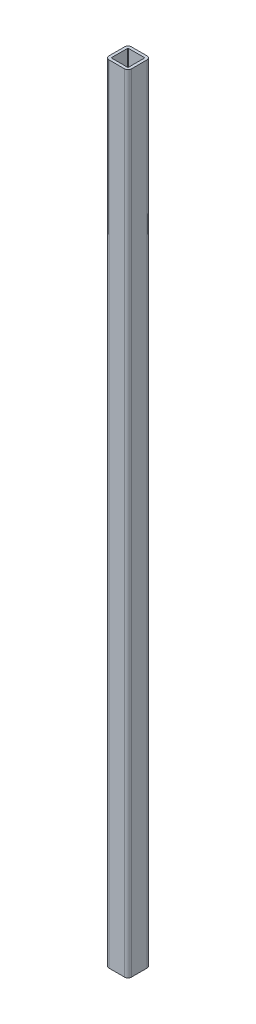
ISO-10303-21;
HEADER;
FILE_DESCRIPTION(('STEP AP214'),'2;1');
FILE_NAME('part.step','',(''),(''),'','','');
FILE_SCHEMA(('AUTOMOTIVE_DESIGN { 1 0 10303 214 1 1 1 1 }'));
ENDSEC;
DATA;
#1=APPLICATION_CONTEXT('core data for automotive mechanical design processes');
#2=APPLICATION_PROTOCOL_DEFINITION('international standard','automotive_design',2000,#1);
#3=PRODUCT_CONTEXT('',#1,'mechanical');
#4=PRODUCT('Part','Part','',(#3));
#5=PRODUCT_RELATED_PRODUCT_CATEGORY('part','',(#4));
#6=PRODUCT_DEFINITION_FORMATION('','',#4);
#7=PRODUCT_DEFINITION_CONTEXT('part definition',#1,'design');
#8=PRODUCT_DEFINITION('design','',#6,#7);
#9=PRODUCT_DEFINITION_SHAPE('','',#8);
#10=(LENGTH_UNIT() NAMED_UNIT(*) SI_UNIT(.MILLI.,.METRE.));
#11=(NAMED_UNIT(*) PLANE_ANGLE_UNIT() SI_UNIT($,.RADIAN.));
#12=(NAMED_UNIT(*) SI_UNIT($,.STERADIAN.) SOLID_ANGLE_UNIT());
#13=UNCERTAINTY_MEASURE_WITH_UNIT(LENGTH_MEASURE(1.E-05),#10,'distance_accuracy_value','');
#14=(GEOMETRIC_REPRESENTATION_CONTEXT(3) GLOBAL_UNCERTAINTY_ASSIGNED_CONTEXT((#13)) GLOBAL_UNIT_ASSIGNED_CONTEXT((#10,
#11,#12)) REPRESENTATION_CONTEXT('',''));
#15=CARTESIAN_POINT('',(0.,0.,0.));
#16=DIRECTION('',(0.,0.,1.));
#17=DIRECTION('',(1.,0.,0.));
#18=AXIS2_PLACEMENT_3D('',#15,#16,#17);
#19=CARTESIAN_POINT('',(17.78,1778.,-17.78));
#20=DIRECTION('',(0.,-1.,0.));
#21=DIRECTION('',(0.,0.,-1.));
#22=AXIS2_PLACEMENT_3D('',#19,#20,#21);
#23=PLANE('',#22);
#24=CARTESIAN_POINT('',(17.78,1778.,-17.78));
#25=DIRECTION('',(0.,1.,0.));
#26=DIRECTION('',(0.,0.,-1.));
#27=AXIS2_PLACEMENT_3D('',#24,#25,#26);
#28=CIRCLE('',#27,7.62);
#29=CARTESIAN_POINT('',(25.4,1778.,-17.78));
#30=VERTEX_POINT('',#29);
#31=CARTESIAN_POINT('',(17.78,1778.,-25.4));
#32=VERTEX_POINT('',#31);
#33=EDGE_CURVE('E211',#30,#32,#28,.T.);
#34=ORIENTED_EDGE('',*,*,#33,.T.);
#35=DIRECTION('',(-1.,0.,0.));
#36=VECTOR('',#35,1.);
#37=CARTESIAN_POINT('',(-17.78,1778.,-25.4));
#38=LINE('',#37,#36);
#39=CARTESIAN_POINT('',(-17.78,1778.,-25.4));
#40=VERTEX_POINT('',#39);
#41=EDGE_CURVE('E214',#32,#40,#38,.T.);
#42=ORIENTED_EDGE('',*,*,#41,.T.);
#43=CARTESIAN_POINT('',(-17.78,1778.,-17.78));
#44=DIRECTION('',(0.,1.,0.));
#45=DIRECTION('',(0.,0.,-1.));
#46=AXIS2_PLACEMENT_3D('',#43,#44,#45);
#47=CIRCLE('',#46,7.62);
#48=CARTESIAN_POINT('',(-25.4,1778.,-17.78));
#49=VERTEX_POINT('',#48);
#50=EDGE_CURVE('E217',#40,#49,#47,.T.);
#51=ORIENTED_EDGE('',*,*,#50,.T.);
#52=DIRECTION('',(0.,0.,1.));
#53=VECTOR('',#52,1.);
#54=CARTESIAN_POINT('',(-25.4,1778.,17.78));
#55=LINE('',#54,#53);
#56=CARTESIAN_POINT('',(-25.4,1778.,17.78));
#57=VERTEX_POINT('',#56);
#58=EDGE_CURVE('E219',#49,#57,#55,.T.);
#59=ORIENTED_EDGE('',*,*,#58,.T.);
#60=CARTESIAN_POINT('',(-17.78,1778.,17.78));
#61=DIRECTION('',(0.,1.,0.));
#62=DIRECTION('',(0.,0.,-1.));
#63=AXIS2_PLACEMENT_3D('',#60,#61,#62);
#64=CIRCLE('',#63,7.62);
#65=CARTESIAN_POINT('',(-17.78,1778.,25.4));
#66=VERTEX_POINT('',#65);
#67=EDGE_CURVE('E221',#57,#66,#64,.T.);
#68=ORIENTED_EDGE('',*,*,#67,.T.);
#69=DIRECTION('',(1.,0.,0.));
#70=VECTOR('',#69,1.);
#71=CARTESIAN_POINT('',(-17.78,1778.,25.4));
#72=LINE('',#71,#70);
#73=CARTESIAN_POINT('',(17.78,1778.,25.4));
#74=VERTEX_POINT('',#73);
#75=EDGE_CURVE('E223',#66,#74,#72,.T.);
#76=ORIENTED_EDGE('',*,*,#75,.T.);
#77=CARTESIAN_POINT('',(17.78,1778.,17.78));
#78=DIRECTION('',(0.,1.,0.));
#79=DIRECTION('',(0.,0.,1.));
#80=AXIS2_PLACEMENT_3D('',#77,#78,#79);
#81=CIRCLE('',#80,7.62);
#82=CARTESIAN_POINT('',(25.4,1778.,17.78));
#83=VERTEX_POINT('',#82);
#84=EDGE_CURVE('E225',#74,#83,#81,.T.);
#85=ORIENTED_EDGE('',*,*,#84,.T.);
#86=DIRECTION('',(0.,0.,-1.));
#87=VECTOR('',#86,1.);
#88=CARTESIAN_POINT('',(25.4,1778.,17.78));
#89=LINE('',#88,#87);
#90=EDGE_CURVE('E227',#83,#30,#89,.T.);
#91=ORIENTED_EDGE('',*,*,#90,.T.);
#92=EDGE_LOOP('',(#34,#42,#51,#59,#68,#76,#85,#91));
#93=FACE_BOUND('',#92,.T.);
#94=CARTESIAN_POINT('',(-17.78,1778.,17.78));
#95=DIRECTION('',(0.,1.,0.));
#96=DIRECTION('',(0.,0.,-1.));
#97=AXIS2_PLACEMENT_3D('',#94,#95,#96);
#98=CIRCLE('',#97,1.27);
#99=CARTESIAN_POINT('',(-19.05,1778.,17.78));
#100=VERTEX_POINT('',#99);
#101=CARTESIAN_POINT('',(-17.78,1778.,19.05));
#102=VERTEX_POINT('',#101);
#103=EDGE_CURVE('E146',#100,#102,#98,.T.);
#104=ORIENTED_EDGE('',*,*,#103,.F.);
#105=DIRECTION('',(0.,0.,1.));
#106=VECTOR('',#105,1.);
#107=CARTESIAN_POINT('',(-19.05,1778.,17.78));
#108=LINE('',#107,#106);
#109=CARTESIAN_POINT('',(-19.05,1778.,-17.78));
#110=VERTEX_POINT('',#109);
#111=EDGE_CURVE('E179',#110,#100,#108,.T.);
#112=ORIENTED_EDGE('',*,*,#111,.F.);
#113=CARTESIAN_POINT('',(-17.78,1778.,-17.78));
#114=DIRECTION('',(0.,1.,0.));
#115=DIRECTION('',(0.,0.,-1.));
#116=AXIS2_PLACEMENT_3D('',#113,#114,#115);
#117=CIRCLE('',#116,1.27);
#118=CARTESIAN_POINT('',(-17.78,1778.,-19.05));
#119=VERTEX_POINT('',#118);
#120=EDGE_CURVE('E177',#119,#110,#117,.T.);
#121=ORIENTED_EDGE('',*,*,#120,.F.);
#122=DIRECTION('',(-1.,0.,0.));
#123=VECTOR('',#122,1.);
#124=CARTESIAN_POINT('',(-17.78,1778.,-19.05));
#125=LINE('',#124,#123);
#126=CARTESIAN_POINT('',(17.78,1778.,-19.05));
#127=VERTEX_POINT('',#126);
#128=EDGE_CURVE('E175',#127,#119,#125,.T.);
#129=ORIENTED_EDGE('',*,*,#128,.F.);
#130=CARTESIAN_POINT('',(17.78,1778.,-17.78));
#131=DIRECTION('',(0.,1.,0.));
#132=DIRECTION('',(0.,0.,-1.));
#133=AXIS2_PLACEMENT_3D('',#130,#131,#132);
#134=CIRCLE('',#133,1.27);
#135=CARTESIAN_POINT('',(19.05,1778.,-17.78));
#136=VERTEX_POINT('',#135);
#137=EDGE_CURVE('E173',#136,#127,#134,.T.);
#138=ORIENTED_EDGE('',*,*,#137,.F.);
#139=DIRECTION('',(0.,0.,-1.));
#140=VECTOR('',#139,1.);
#141=CARTESIAN_POINT('',(19.05,1778.,17.78));
#142=LINE('',#141,#140);
#143=CARTESIAN_POINT('',(19.05,1778.,17.78));
#144=VERTEX_POINT('',#143);
#145=EDGE_CURVE('E169',#144,#136,#142,.T.);
#146=ORIENTED_EDGE('',*,*,#145,.F.);
#147=CARTESIAN_POINT('',(17.78,1778.,17.78));
#148=DIRECTION('',(0.,1.,0.));
#149=DIRECTION('',(0.,0.,1.));
#150=AXIS2_PLACEMENT_3D('',#147,#148,#149);
#151=CIRCLE('',#150,1.27);
#152=CARTESIAN_POINT('',(17.78,1778.,19.05));
#153=VERTEX_POINT('',#152);
#154=EDGE_CURVE('E167',#153,#144,#151,.T.);
#155=ORIENTED_EDGE('',*,*,#154,.F.);
#156=DIRECTION('',(1.,0.,0.));
#157=VECTOR('',#156,1.);
#158=CARTESIAN_POINT('',(-17.78,1778.,19.05));
#159=LINE('',#158,#157);
#160=EDGE_CURVE('E154',#102,#153,#159,.T.);
#161=ORIENTED_EDGE('',*,*,#160,.F.);
#162=EDGE_LOOP('',(#104,#112,#121,#129,#138,#146,#155,#161));
#163=FACE_BOUND('',#162,.T.);
#164=ADVANCED_FACE('F33',(#93,#163),#23,.F.);
#165=CARTESIAN_POINT('',(17.78,0.,-17.78));
#166=DIRECTION('',(0.,-1.,0.));
#167=DIRECTION('',(0.,0.,-1.));
#168=AXIS2_PLACEMENT_3D('',#165,#166,#167);
#169=PLANE('',#168);
#170=CARTESIAN_POINT('',(17.78,0.,-17.78));
#171=DIRECTION('',(0.,1.,0.));
#172=DIRECTION('',(0.,0.,-1.));
#173=AXIS2_PLACEMENT_3D('',#170,#171,#172);
#174=CIRCLE('',#173,7.62);
#175=CARTESIAN_POINT('',(25.4,0.,-17.78));
#176=VERTEX_POINT('',#175);
#177=CARTESIAN_POINT('',(17.78,0.,-25.4));
#178=VERTEX_POINT('',#177);
#179=EDGE_CURVE('E162',#176,#178,#174,.T.);
#180=ORIENTED_EDGE('',*,*,#179,.F.);
#181=DIRECTION('',(0.,0.,-1.));
#182=VECTOR('',#181,1.);
#183=CARTESIAN_POINT('',(25.4,0.,17.78));
#184=LINE('',#183,#182);
#185=CARTESIAN_POINT('',(25.4,0.,17.78));
#186=VERTEX_POINT('',#185);
#187=EDGE_CURVE('E215',#186,#176,#184,.T.);
#188=ORIENTED_EDGE('',*,*,#187,.F.);
#189=CARTESIAN_POINT('',(17.78,0.,17.78));
#190=DIRECTION('',(0.,1.,0.));
#191=DIRECTION('',(0.,0.,1.));
#192=AXIS2_PLACEMENT_3D('',#189,#190,#191);
#193=CIRCLE('',#192,7.62);
#194=CARTESIAN_POINT('',(17.78,0.,25.4));
#195=VERTEX_POINT('',#194);
#196=EDGE_CURVE('E242',#195,#186,#193,.T.);
#197=ORIENTED_EDGE('',*,*,#196,.F.);
#198=DIRECTION('',(1.,0.,0.));
#199=VECTOR('',#198,1.);
#200=CARTESIAN_POINT('',(-17.78,0.,25.4));
#201=LINE('',#200,#199);
#202=CARTESIAN_POINT('',(-17.78,0.,25.4));
#203=VERTEX_POINT('',#202);
#204=EDGE_CURVE('E240',#203,#195,#201,.T.);
#205=ORIENTED_EDGE('',*,*,#204,.F.);
#206=CARTESIAN_POINT('',(-17.78,0.,17.78));
#207=DIRECTION('',(0.,1.,0.));
#208=DIRECTION('',(0.,0.,-1.));
#209=AXIS2_PLACEMENT_3D('',#206,#207,#208);
#210=CIRCLE('',#209,7.62);
#211=CARTESIAN_POINT('',(-25.4,0.,17.78));
#212=VERTEX_POINT('',#211);
#213=EDGE_CURVE('E238',#212,#203,#210,.T.);
#214=ORIENTED_EDGE('',*,*,#213,.F.);
#215=DIRECTION('',(0.,0.,1.));
#216=VECTOR('',#215,1.);
#217=CARTESIAN_POINT('',(-25.4,0.,17.78));
#218=LINE('',#217,#216);
#219=CARTESIAN_POINT('',(-25.4,0.,-17.78));
#220=VERTEX_POINT('',#219);
#221=EDGE_CURVE('E236',#220,#212,#218,.T.);
#222=ORIENTED_EDGE('',*,*,#221,.F.);
#223=CARTESIAN_POINT('',(-17.78,0.,-17.78));
#224=DIRECTION('',(0.,1.,0.));
#225=DIRECTION('',(0.,0.,-1.));
#226=AXIS2_PLACEMENT_3D('',#223,#224,#225);
#227=CIRCLE('',#226,7.62);
#228=CARTESIAN_POINT('',(-17.78,0.,-25.4));
#229=VERTEX_POINT('',#228);
#230=EDGE_CURVE('E234',#229,#220,#227,.T.);
#231=ORIENTED_EDGE('',*,*,#230,.F.);
#232=DIRECTION('',(-1.,0.,0.));
#233=VECTOR('',#232,1.);
#234=CARTESIAN_POINT('',(-17.78,0.,-25.4));
#235=LINE('',#234,#233);
#236=EDGE_CURVE('E232',#178,#229,#235,.T.);
#237=ORIENTED_EDGE('',*,*,#236,.F.);
#238=EDGE_LOOP('',(#180,#188,#197,#205,#214,#222,#231,#237));
#239=FACE_BOUND('',#238,.T.);
#240=DIRECTION('',(0.,0.,1.));
#241=VECTOR('',#240,1.);
#242=CARTESIAN_POINT('',(-19.05,0.,17.78));
#243=LINE('',#242,#241);
#244=CARTESIAN_POINT('',(-19.05,0.,-17.78));
#245=VERTEX_POINT('',#244);
#246=CARTESIAN_POINT('',(-19.05,0.,17.78));
#247=VERTEX_POINT('',#246);
#248=EDGE_CURVE('E155',#245,#247,#243,.T.);
#249=ORIENTED_EDGE('',*,*,#248,.T.);
#250=CARTESIAN_POINT('',(-17.78,0.,17.78));
#251=DIRECTION('',(0.,1.,0.));
#252=DIRECTION('',(0.,0.,-1.));
#253=AXIS2_PLACEMENT_3D('',#250,#251,#252);
#254=CIRCLE('',#253,1.27);
#255=CARTESIAN_POINT('',(-17.78,0.,19.05));
#256=VERTEX_POINT('',#255);
#257=EDGE_CURVE('E56',#247,#256,#254,.T.);
#258=ORIENTED_EDGE('',*,*,#257,.T.);
#259=DIRECTION('',(1.,0.,0.));
#260=VECTOR('',#259,1.);
#261=CARTESIAN_POINT('',(-17.78,0.,19.05));
#262=LINE('',#261,#260);
#263=CARTESIAN_POINT('',(17.78,0.,19.05));
#264=VERTEX_POINT('',#263);
#265=EDGE_CURVE('E161',#256,#264,#262,.T.);
#266=ORIENTED_EDGE('',*,*,#265,.T.);
#267=CARTESIAN_POINT('',(17.78,0.,17.78));
#268=DIRECTION('',(0.,1.,0.));
#269=DIRECTION('',(0.,0.,1.));
#270=AXIS2_PLACEMENT_3D('',#267,#268,#269);
#271=CIRCLE('',#270,1.27);
#272=CARTESIAN_POINT('',(19.05,0.,17.78));
#273=VERTEX_POINT('',#272);
#274=EDGE_CURVE('E183',#264,#273,#271,.T.);
#275=ORIENTED_EDGE('',*,*,#274,.T.);
#276=DIRECTION('',(0.,0.,-1.));
#277=VECTOR('',#276,1.);
#278=CARTESIAN_POINT('',(19.05,0.,17.78));
#279=LINE('',#278,#277);
#280=CARTESIAN_POINT('',(19.05,0.,-17.78));
#281=VERTEX_POINT('',#280);
#282=EDGE_CURVE('E186',#273,#281,#279,.T.);
#283=ORIENTED_EDGE('',*,*,#282,.T.);
#284=CARTESIAN_POINT('',(17.78,0.,-17.78));
#285=DIRECTION('',(0.,1.,0.));
#286=DIRECTION('',(0.,0.,-1.));
#287=AXIS2_PLACEMENT_3D('',#284,#285,#286);
#288=CIRCLE('',#287,1.27);
#289=CARTESIAN_POINT('',(17.78,0.,-19.05));
#290=VERTEX_POINT('',#289);
#291=EDGE_CURVE('E189',#281,#290,#288,.T.);
#292=ORIENTED_EDGE('',*,*,#291,.T.);
#293=DIRECTION('',(-1.,0.,0.));
#294=VECTOR('',#293,1.);
#295=CARTESIAN_POINT('',(-17.78,0.,-19.05));
#296=LINE('',#295,#294);
#297=CARTESIAN_POINT('',(-17.78,0.,-19.05));
#298=VERTEX_POINT('',#297);
#299=EDGE_CURVE('E192',#290,#298,#296,.T.);
#300=ORIENTED_EDGE('',*,*,#299,.T.);
#301=CARTESIAN_POINT('',(-17.78,0.,-17.78));
#302=DIRECTION('',(0.,1.,0.));
#303=DIRECTION('',(0.,0.,-1.));
#304=AXIS2_PLACEMENT_3D('',#301,#302,#303);
#305=CIRCLE('',#304,1.27);
#306=EDGE_CURVE('E195',#298,#245,#305,.T.);
#307=ORIENTED_EDGE('',*,*,#306,.T.);
#308=EDGE_LOOP('',(#249,#258,#266,#275,#283,#292,#300,#307));
#309=FACE_BOUND('',#308,.T.);
#310=ADVANCED_FACE('F272',(#239,#309),#169,.T.);
#311=CARTESIAN_POINT('',(17.78,1778.,-17.78));
#312=DIRECTION('',(0.,-1.,0.));
#313=DIRECTION('',(0.,0.,-1.));
#314=AXIS2_PLACEMENT_3D('',#311,#312,#313);
#315=CYLINDRICAL_SURFACE('',#314,7.62);
#316=ORIENTED_EDGE('',*,*,#179,.T.);
#317=DIRECTION('',(0.,-1.,0.));
#318=VECTOR('',#317,1.);
#319=CARTESIAN_POINT('',(17.78,1778.,-25.4));
#320=LINE('',#319,#318);
#321=EDGE_CURVE('E11',#32,#178,#320,.T.);
#322=ORIENTED_EDGE('',*,*,#321,.F.);
#323=ORIENTED_EDGE('',*,*,#33,.F.);
#324=DIRECTION('',(0.,-1.,0.));
#325=VECTOR('',#324,1.);
#326=CARTESIAN_POINT('',(25.4,1778.,-17.78));
#327=LINE('',#326,#325);
#328=EDGE_CURVE('E229',#30,#176,#327,.T.);
#329=ORIENTED_EDGE('',*,*,#328,.T.);
#330=EDGE_LOOP('',(#316,#322,#323,#329));
#331=FACE_BOUND('',#330,.T.);
#332=ADVANCED_FACE('F35',(#331),#315,.T.);
#333=CARTESIAN_POINT('',(-17.78,1778.,-25.4));
#334=DIRECTION('',(0.,0.,1.));
#335=DIRECTION('',(1.,0.,0.));
#336=AXIS2_PLACEMENT_3D('',#333,#334,#335);
#337=PLANE('',#336);
#338=ORIENTED_EDGE('',*,*,#236,.T.);
#339=DIRECTION('',(0.,-1.,0.));
#340=VECTOR('',#339,1.);
#341=CARTESIAN_POINT('',(-17.78,1778.,-25.4));
#342=LINE('',#341,#340);
#343=EDGE_CURVE('E41',#40,#229,#342,.T.);
#344=ORIENTED_EDGE('',*,*,#343,.F.);
#345=ORIENTED_EDGE('',*,*,#41,.F.);
#346=ORIENTED_EDGE('',*,*,#321,.T.);
#347=EDGE_LOOP('',(#338,#344,#345,#346));
#348=FACE_BOUND('',#347,.T.);
#349=ADVANCED_FACE('F289',(#348),#337,.F.);
#350=CARTESIAN_POINT('',(-17.78,1778.,-17.78));
#351=DIRECTION('',(0.,-1.,0.));
#352=DIRECTION('',(0.,0.,-1.));
#353=AXIS2_PLACEMENT_3D('',#350,#351,#352);
#354=CYLINDRICAL_SURFACE('',#353,7.62);
#355=ORIENTED_EDGE('',*,*,#230,.T.);
#356=DIRECTION('',(0.,-1.,0.));
#357=VECTOR('',#356,1.);
#358=CARTESIAN_POINT('',(-25.4,1778.,-17.78));
#359=LINE('',#358,#357);
#360=EDGE_CURVE('E259',#49,#220,#359,.T.);
#361=ORIENTED_EDGE('',*,*,#360,.F.);
#362=ORIENTED_EDGE('',*,*,#50,.F.);
#363=ORIENTED_EDGE('',*,*,#343,.T.);
#364=EDGE_LOOP('',(#355,#361,#362,#363));
#365=FACE_BOUND('',#364,.T.);
#366=ADVANCED_FACE('F266',(#365),#354,.T.);
#367=CARTESIAN_POINT('',(-25.4,1778.,17.78));
#368=DIRECTION('',(1.,0.,0.));
#369=DIRECTION('',(0.,0.,-1.));
#370=AXIS2_PLACEMENT_3D('',#367,#368,#369);
#371=PLANE('',#370);
#372=ORIENTED_EDGE('',*,*,#221,.T.);
#373=DIRECTION('',(0.,-1.,0.));
#374=VECTOR('',#373,1.);
#375=CARTESIAN_POINT('',(-25.4,1778.,17.78));
#376=LINE('',#375,#374);
#377=EDGE_CURVE('E256',#57,#212,#376,.T.);
#378=ORIENTED_EDGE('',*,*,#377,.F.);
#379=ORIENTED_EDGE('',*,*,#58,.F.);
#380=ORIENTED_EDGE('',*,*,#360,.T.);
#381=EDGE_LOOP('',(#372,#378,#379,#380));
#382=FACE_BOUND('',#381,.T.);
#383=ADVANCED_FACE('F278',(#382),#371,.F.);
#384=CARTESIAN_POINT('',(-17.78,1778.,17.78));
#385=DIRECTION('',(0.,-1.,0.));
#386=DIRECTION('',(0.,0.,-1.));
#387=AXIS2_PLACEMENT_3D('',#384,#385,#386);
#388=CYLINDRICAL_SURFACE('',#387,7.62);
#389=ORIENTED_EDGE('',*,*,#213,.T.);
#390=DIRECTION('',(0.,-1.,0.));
#391=VECTOR('',#390,1.);
#392=CARTESIAN_POINT('',(-17.78,1778.,25.4));
#393=LINE('',#392,#391);
#394=EDGE_CURVE('E253',#66,#203,#393,.T.);
#395=ORIENTED_EDGE('',*,*,#394,.F.);
#396=ORIENTED_EDGE('',*,*,#67,.F.);
#397=ORIENTED_EDGE('',*,*,#377,.T.);
#398=EDGE_LOOP('',(#389,#395,#396,#397));
#399=FACE_BOUND('',#398,.T.);
#400=ADVANCED_FACE('F282',(#399),#388,.T.);
#401=CARTESIAN_POINT('',(-17.78,1778.,25.4));
#402=DIRECTION('',(0.,0.,-1.));
#403=DIRECTION('',(-1.,0.,0.));
#404=AXIS2_PLACEMENT_3D('',#401,#402,#403);
#405=PLANE('',#404);
#406=ORIENTED_EDGE('',*,*,#204,.T.);
#407=DIRECTION('',(0.,-1.,0.));
#408=VECTOR('',#407,1.);
#409=CARTESIAN_POINT('',(17.78,1778.,25.4));
#410=LINE('',#409,#408);
#411=EDGE_CURVE('E250',#74,#195,#410,.T.);
#412=ORIENTED_EDGE('',*,*,#411,.F.);
#413=ORIENTED_EDGE('',*,*,#75,.F.);
#414=ORIENTED_EDGE('',*,*,#394,.T.);
#415=EDGE_LOOP('',(#406,#412,#413,#414));
#416=FACE_BOUND('',#415,.T.);
#417=ADVANCED_FACE('F302',(#416),#405,.F.);
#418=CARTESIAN_POINT('',(17.78,1778.,17.78));
#419=DIRECTION('',(0.,-1.,0.));
#420=DIRECTION('',(0.,0.,-1.));
#421=AXIS2_PLACEMENT_3D('',#418,#419,#420);
#422=CYLINDRICAL_SURFACE('',#421,7.62);
#423=ORIENTED_EDGE('',*,*,#196,.T.);
#424=DIRECTION('',(0.,-1.,0.));
#425=VECTOR('',#424,1.);
#426=CARTESIAN_POINT('',(25.4,1778.,17.78));
#427=LINE('',#426,#425);
#428=EDGE_CURVE('E247',#83,#186,#427,.T.);
#429=ORIENTED_EDGE('',*,*,#428,.F.);
#430=ORIENTED_EDGE('',*,*,#84,.F.);
#431=ORIENTED_EDGE('',*,*,#411,.T.);
#432=EDGE_LOOP('',(#423,#429,#430,#431));
#433=FACE_BOUND('',#432,.T.);
#434=ADVANCED_FACE('F300',(#433),#422,.T.);
#435=CARTESIAN_POINT('',(25.4,1778.,17.78));
#436=DIRECTION('',(-1.,0.,0.));
#437=DIRECTION('',(0.,0.,1.));
#438=AXIS2_PLACEMENT_3D('',#435,#436,#437);
#439=PLANE('',#438);
#440=ORIENTED_EDGE('',*,*,#187,.T.);
#441=ORIENTED_EDGE('',*,*,#328,.F.);
#442=ORIENTED_EDGE('',*,*,#90,.F.);
#443=ORIENTED_EDGE('',*,*,#428,.T.);
#444=EDGE_LOOP('',(#440,#441,#442,#443));
#445=FACE_BOUND('',#444,.T.);
#446=ADVANCED_FACE('F295',(#445),#439,.F.);
#447=CARTESIAN_POINT('',(-17.78,1778.,17.78));
#448=DIRECTION('',(0.,-1.,0.));
#449=DIRECTION('',(0.,0.,-1.));
#450=AXIS2_PLACEMENT_3D('',#447,#448,#449);
#451=CYLINDRICAL_SURFACE('',#450,1.27);
#452=ORIENTED_EDGE('',*,*,#257,.F.);
#453=DIRECTION('',(0.,-1.,0.));
#454=VECTOR('',#453,1.);
#455=CARTESIAN_POINT('',(-19.05,1778.,17.78));
#456=LINE('',#455,#454);
#457=EDGE_CURVE('E150',#100,#247,#456,.T.);
#458=ORIENTED_EDGE('',*,*,#457,.F.);
#459=ORIENTED_EDGE('',*,*,#103,.T.);
#460=DIRECTION('',(0.,-1.,0.));
#461=VECTOR('',#460,1.);
#462=CARTESIAN_POINT('',(-17.78,1778.,19.05));
#463=LINE('',#462,#461);
#464=EDGE_CURVE('E149',#102,#256,#463,.T.);
#465=ORIENTED_EDGE('',*,*,#464,.T.);
#466=EDGE_LOOP('',(#452,#458,#459,#465));
#467=FACE_BOUND('',#466,.T.);
#468=ADVANCED_FACE('F148',(#467),#451,.F.);
#469=CARTESIAN_POINT('',(-17.78,1778.,19.05));
#470=DIRECTION('',(0.,0.,-1.));
#471=DIRECTION('',(-1.,0.,0.));
#472=AXIS2_PLACEMENT_3D('',#469,#470,#471);
#473=PLANE('',#472);
#474=ORIENTED_EDGE('',*,*,#265,.F.);
#475=ORIENTED_EDGE('',*,*,#464,.F.);
#476=ORIENTED_EDGE('',*,*,#160,.T.);
#477=DIRECTION('',(0.,-1.,0.));
#478=VECTOR('',#477,1.);
#479=CARTESIAN_POINT('',(17.78,1778.,19.05));
#480=LINE('',#479,#478);
#481=EDGE_CURVE('E163',#153,#264,#480,.T.);
#482=ORIENTED_EDGE('',*,*,#481,.T.);
#483=EDGE_LOOP('',(#474,#475,#476,#482));
#484=FACE_BOUND('',#483,.T.);
#485=ADVANCED_FACE('F158',(#484),#473,.T.);
#486=CARTESIAN_POINT('',(17.78,1778.,17.78));
#487=DIRECTION('',(0.,-1.,0.));
#488=DIRECTION('',(0.,0.,-1.));
#489=AXIS2_PLACEMENT_3D('',#486,#487,#488);
#490=CYLINDRICAL_SURFACE('',#489,1.27);
#491=ORIENTED_EDGE('',*,*,#274,.F.);
#492=ORIENTED_EDGE('',*,*,#481,.F.);
#493=ORIENTED_EDGE('',*,*,#154,.T.);
#494=DIRECTION('',(0.,-1.,0.));
#495=VECTOR('',#494,1.);
#496=CARTESIAN_POINT('',(19.05,1778.,17.78));
#497=LINE('',#496,#495);
#498=EDGE_CURVE('E208',#144,#273,#497,.T.);
#499=ORIENTED_EDGE('',*,*,#498,.T.);
#500=EDGE_LOOP('',(#491,#492,#493,#499));
#501=FACE_BOUND('',#500,.T.);
#502=ADVANCED_FACE('F327',(#501),#490,.F.);
#503=CARTESIAN_POINT('',(19.05,1778.,17.78));
#504=DIRECTION('',(-1.,0.,0.));
#505=DIRECTION('',(0.,0.,1.));
#506=AXIS2_PLACEMENT_3D('',#503,#504,#505);
#507=PLANE('',#506);
#508=ORIENTED_EDGE('',*,*,#282,.F.);
#509=ORIENTED_EDGE('',*,*,#498,.F.);
#510=ORIENTED_EDGE('',*,*,#145,.T.);
#511=DIRECTION('',(0.,-1.,0.));
#512=VECTOR('',#511,1.);
#513=CARTESIAN_POINT('',(19.05,1778.,-17.78));
#514=LINE('',#513,#512);
#515=EDGE_CURVE('E206',#136,#281,#514,.T.);
#516=ORIENTED_EDGE('',*,*,#515,.T.);
#517=EDGE_LOOP('',(#508,#509,#510,#516));
#518=FACE_BOUND('',#517,.T.);
#519=ADVANCED_FACE('F331',(#518),#507,.T.);
#520=CARTESIAN_POINT('',(17.78,1778.,-17.78));
#521=DIRECTION('',(0.,-1.,0.));
#522=DIRECTION('',(0.,0.,-1.));
#523=AXIS2_PLACEMENT_3D('',#520,#521,#522);
#524=CYLINDRICAL_SURFACE('',#523,1.27);
#525=ORIENTED_EDGE('',*,*,#291,.F.);
#526=ORIENTED_EDGE('',*,*,#515,.F.);
#527=ORIENTED_EDGE('',*,*,#137,.T.);
#528=DIRECTION('',(0.,-1.,0.));
#529=VECTOR('',#528,1.);
#530=CARTESIAN_POINT('',(17.78,1778.,-19.05));
#531=LINE('',#530,#529);
#532=EDGE_CURVE('E204',#127,#290,#531,.T.);
#533=ORIENTED_EDGE('',*,*,#532,.T.);
#534=EDGE_LOOP('',(#525,#526,#527,#533));
#535=FACE_BOUND('',#534,.T.);
#536=ADVANCED_FACE('F337',(#535),#524,.F.);
#537=CARTESIAN_POINT('',(-17.78,1778.,-19.05));
#538=DIRECTION('',(0.,0.,1.));
#539=DIRECTION('',(1.,0.,0.));
#540=AXIS2_PLACEMENT_3D('',#537,#538,#539);
#541=PLANE('',#540);
#542=ORIENTED_EDGE('',*,*,#299,.F.);
#543=ORIENTED_EDGE('',*,*,#532,.F.);
#544=ORIENTED_EDGE('',*,*,#128,.T.);
#545=DIRECTION('',(0.,-1.,0.));
#546=VECTOR('',#545,1.);
#547=CARTESIAN_POINT('',(-17.78,1778.,-19.05));
#548=LINE('',#547,#546);
#549=EDGE_CURVE('E202',#119,#298,#548,.T.);
#550=ORIENTED_EDGE('',*,*,#549,.T.);
#551=EDGE_LOOP('',(#542,#543,#544,#550));
#552=FACE_BOUND('',#551,.T.);
#553=ADVANCED_FACE('F341',(#552),#541,.T.);
#554=CARTESIAN_POINT('',(-17.78,1778.,-17.78));
#555=DIRECTION('',(0.,-1.,0.));
#556=DIRECTION('',(0.,0.,-1.));
#557=AXIS2_PLACEMENT_3D('',#554,#555,#556);
#558=CYLINDRICAL_SURFACE('',#557,1.27);
#559=ORIENTED_EDGE('',*,*,#306,.F.);
#560=ORIENTED_EDGE('',*,*,#549,.F.);
#561=ORIENTED_EDGE('',*,*,#120,.T.);
#562=DIRECTION('',(0.,-1.,0.));
#563=VECTOR('',#562,1.);
#564=CARTESIAN_POINT('',(-19.05,1778.,-17.78));
#565=LINE('',#564,#563);
#566=EDGE_CURVE('E48',#110,#245,#565,.T.);
#567=ORIENTED_EDGE('',*,*,#566,.T.);
#568=EDGE_LOOP('',(#559,#560,#561,#567));
#569=FACE_BOUND('',#568,.T.);
#570=ADVANCED_FACE('F345',(#569),#558,.F.);
#571=CARTESIAN_POINT('',(-19.05,1778.,17.78));
#572=DIRECTION('',(1.,0.,0.));
#573=DIRECTION('',(0.,0.,-1.));
#574=AXIS2_PLACEMENT_3D('',#571,#572,#573);
#575=PLANE('',#574);
#576=ORIENTED_EDGE('',*,*,#248,.F.);
#577=ORIENTED_EDGE('',*,*,#566,.F.);
#578=ORIENTED_EDGE('',*,*,#111,.T.);
#579=ORIENTED_EDGE('',*,*,#457,.T.);
#580=EDGE_LOOP('',(#576,#577,#578,#579));
#581=FACE_BOUND('',#580,.T.);
#582=ADVANCED_FACE('F349',(#581),#575,.T.);
#583=CLOSED_SHELL('',(#164,#310,#332,#349,#366,#383,#400,#417,#434,#446,#468,#485,#502,#519,
#536,#553,#570,#582));
#584=MANIFOLD_SOLID_BREP('B2',#583);
#585=ADVANCED_BREP_SHAPE_REPRESENTATION('',(#18,#584),#14);
#586=SHAPE_DEFINITION_REPRESENTATION(#9,#585);
ENDSEC;
END-ISO-10303-21;
